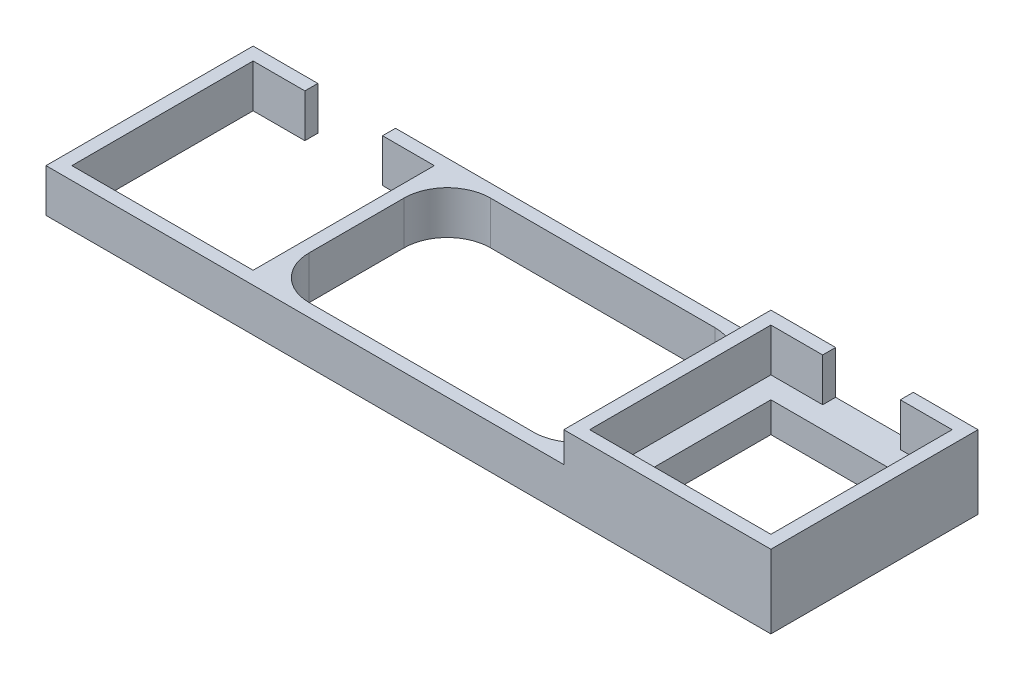
ISO-10303-21;
HEADER;
FILE_DESCRIPTION(('STEP AP214'),'2;1');
FILE_NAME('part.step','',(''),(''),'','','');
FILE_SCHEMA(('AUTOMOTIVE_DESIGN { 1 0 10303 214 1 1 1 1 }'));
ENDSEC;
DATA;
#1=APPLICATION_CONTEXT('core data for automotive mechanical design processes');
#2=APPLICATION_PROTOCOL_DEFINITION('international standard','automotive_design',2000,#1);
#3=PRODUCT_CONTEXT('',#1,'mechanical');
#4=PRODUCT('Part','Part','',(#3));
#5=PRODUCT_RELATED_PRODUCT_CATEGORY('part','',(#4));
#6=PRODUCT_DEFINITION_FORMATION('','',#4);
#7=PRODUCT_DEFINITION_CONTEXT('part definition',#1,'design');
#8=PRODUCT_DEFINITION('design','',#6,#7);
#9=PRODUCT_DEFINITION_SHAPE('','',#8);
#10=(LENGTH_UNIT() NAMED_UNIT(*) SI_UNIT(.MILLI.,.METRE.));
#11=(NAMED_UNIT(*) PLANE_ANGLE_UNIT() SI_UNIT($,.RADIAN.));
#12=(NAMED_UNIT(*) SI_UNIT($,.STERADIAN.) SOLID_ANGLE_UNIT());
#13=UNCERTAINTY_MEASURE_WITH_UNIT(LENGTH_MEASURE(1.E-05),#10,'distance_accuracy_value','');
#14=(GEOMETRIC_REPRESENTATION_CONTEXT(3) GLOBAL_UNCERTAINTY_ASSIGNED_CONTEXT((#13)) GLOBAL_UNIT_ASSIGNED_CONTEXT((#10,
#11,#12)) REPRESENTATION_CONTEXT('',''));
#15=CARTESIAN_POINT('',(0.,0.,0.));
#16=DIRECTION('',(0.,0.,1.));
#17=DIRECTION('',(1.,0.,0.));
#18=AXIS2_PLACEMENT_3D('',#15,#16,#17);
#19=CARTESIAN_POINT('',(-30.,10.,-35.));
#20=DIRECTION('',(-1.,0.,0.));
#21=DIRECTION('',(0.,-1.,0.));
#22=AXIS2_PLACEMENT_3D('',#19,#20,#21);
#23=PLANE('',#22);
#24=DIRECTION('',(0.,0.,1.));
#25=VECTOR('',#24,1.);
#26=CARTESIAN_POINT('',(-30.,7.,-64.313207915828));
#27=LINE('',#26,#25);
#28=CARTESIAN_POINT('',(-30.,7.,-45.));
#29=VERTEX_POINT('',#28);
#30=CARTESIAN_POINT('',(-30.,7.,-42.));
#31=VERTEX_POINT('',#30);
#32=EDGE_CURVE('E48',#29,#31,#27,.T.);
#33=ORIENTED_EDGE('',*,*,#32,.F.);
#34=DIRECTION('',(0.,1.,0.));
#35=VECTOR('',#34,1.);
#36=CARTESIAN_POINT('',(-30.,10.,-45.));
#37=LINE('',#36,#35);
#38=CARTESIAN_POINT('',(-30.,17.,-45.));
#39=VERTEX_POINT('',#38);
#40=EDGE_CURVE('E361',#29,#39,#37,.T.);
#41=ORIENTED_EDGE('',*,*,#40,.T.);
#42=DIRECTION('',(0.,0.,-1.));
#43=VECTOR('',#42,1.);
#44=CARTESIAN_POINT('',(-30.,17.,0.));
#45=LINE('',#44,#43);
#46=CARTESIAN_POINT('',(-30.,17.,-42.));
#47=VERTEX_POINT('',#46);
#48=EDGE_CURVE('E310',#47,#39,#45,.T.);
#49=ORIENTED_EDGE('',*,*,#48,.F.);
#50=DIRECTION('',(0.,-1.,0.));
#51=VECTOR('',#50,1.);
#52=CARTESIAN_POINT('',(-30.,10.,-42.));
#53=LINE('',#52,#51);
#54=EDGE_CURVE('E264',#47,#31,#53,.T.);
#55=ORIENTED_EDGE('',*,*,#54,.T.);
#56=EDGE_LOOP('',(#33,#41,#49,#55));
#57=FACE_BOUND('',#56,.T.);
#58=ADVANCED_FACE('F33',(#57),#23,.F.);
#59=CARTESIAN_POINT('',(-12.,10.,-35.));
#60=DIRECTION('',(1.,0.,0.));
#61=DIRECTION('',(0.,1.,0.));
#62=AXIS2_PLACEMENT_3D('',#59,#60,#61);
#63=PLANE('',#62);
#64=DIRECTION('',(0.,0.,1.));
#65=VECTOR('',#64,1.);
#66=CARTESIAN_POINT('',(-12.,7.,-64.313207915828));
#67=LINE('',#66,#65);
#68=CARTESIAN_POINT('',(-12.,7.,-45.));
#69=VERTEX_POINT('',#68);
#70=CARTESIAN_POINT('',(-12.,7.,-42.));
#71=VERTEX_POINT('',#70);
#72=EDGE_CURVE('E270',#69,#71,#67,.T.);
#73=ORIENTED_EDGE('',*,*,#72,.T.);
#74=DIRECTION('',(0.,1.,0.));
#75=VECTOR('',#74,1.);
#76=CARTESIAN_POINT('',(-12.,9.99999999999999,-42.));
#77=LINE('',#76,#75);
#78=CARTESIAN_POINT('',(-12.,17.,-42.));
#79=VERTEX_POINT('',#78);
#80=EDGE_CURVE('E255',#71,#79,#77,.T.);
#81=ORIENTED_EDGE('',*,*,#80,.T.);
#82=DIRECTION('',(0.,0.,1.));
#83=VECTOR('',#82,1.);
#84=CARTESIAN_POINT('',(-12.,17.,0.));
#85=LINE('',#84,#83);
#86=CARTESIAN_POINT('',(-12.,17.,-45.));
#87=VERTEX_POINT('',#86);
#88=EDGE_CURVE('E295',#87,#79,#85,.T.);
#89=ORIENTED_EDGE('',*,*,#88,.F.);
#90=DIRECTION('',(0.,-1.,0.));
#91=VECTOR('',#90,1.);
#92=CARTESIAN_POINT('',(-12.,10.,-45.));
#93=LINE('',#92,#91);
#94=EDGE_CURVE('E56',#87,#69,#93,.T.);
#95=ORIENTED_EDGE('',*,*,#94,.T.);
#96=EDGE_LOOP('',(#73,#81,#89,#95));
#97=FACE_BOUND('',#96,.T.);
#98=ADVANCED_FACE('F276',(#97),#63,.F.);
#99=CARTESIAN_POINT('',(0.,10.,0.));
#100=DIRECTION('',(0.,1.,0.));
#101=DIRECTION('',(0.,0.,1.));
#102=AXIS2_PLACEMENT_3D('',#99,#100,#101);
#103=PLANE('',#102);
#104=DIRECTION('',(1.,0.,0.));
#105=VECTOR('',#104,1.);
#106=CARTESIAN_POINT('',(-165.,10.,3.));
#107=LINE('',#106,#105);
#108=CARTESIAN_POINT('',(-165.,10.,3.));
#109=VERTEX_POINT('',#108);
#110=CARTESIAN_POINT('',(-45.,10.,3.));
#111=VERTEX_POINT('',#110);
#112=EDGE_CURVE('E448',#109,#111,#107,.T.);
#113=ORIENTED_EDGE('',*,*,#112,.T.);
#114=DIRECTION('',(0.,0.,-1.));
#115=VECTOR('',#114,1.);
#116=CARTESIAN_POINT('',(-45.,10.,0.));
#117=LINE('',#116,#115);
#118=CARTESIAN_POINT('',(-45.,10.,-10.));
#119=VERTEX_POINT('',#118);
#120=EDGE_CURVE('E282',#111,#119,#117,.T.);
#121=ORIENTED_EDGE('',*,*,#120,.T.);
#122=CARTESIAN_POINT('',(-55.,10.,-10.));
#123=DIRECTION('',(0.,1.,0.));
#124=DIRECTION('',(0.,0.,1.));
#125=AXIS2_PLACEMENT_3D('',#122,#123,#124);
#126=CIRCLE('',#125,10.);
#127=CARTESIAN_POINT('',(-55.,10.,0.));
#128=VERTEX_POINT('',#127);
#129=EDGE_CURVE('E511',#119,#128,#126,.F.);
#130=ORIENTED_EDGE('',*,*,#129,.T.);
#131=DIRECTION('',(1.,0.,0.));
#132=VECTOR('',#131,1.);
#133=CARTESIAN_POINT('',(-117.,10.,0.));
#134=LINE('',#133,#132);
#135=CARTESIAN_POINT('',(-107.,10.,0.));
#136=VERTEX_POINT('',#135);
#137=EDGE_CURVE('E382',#136,#128,#134,.T.);
#138=ORIENTED_EDGE('',*,*,#137,.F.);
#139=CARTESIAN_POINT('',(-107.,10.,-10.));
#140=DIRECTION('',(0.,1.,0.));
#141=DIRECTION('',(0.,0.,1.));
#142=AXIS2_PLACEMENT_3D('',#139,#140,#141);
#143=CIRCLE('',#142,10.);
#144=CARTESIAN_POINT('',(-117.,10.,-10.));
#145=VERTEX_POINT('',#144);
#146=EDGE_CURVE('E11',#136,#145,#143,.F.);
#147=ORIENTED_EDGE('',*,*,#146,.T.);
#148=DIRECTION('',(0.,0.,1.));
#149=VECTOR('',#148,1.);
#150=CARTESIAN_POINT('',(-117.,10.,-42.));
#151=LINE('',#150,#149);
#152=CARTESIAN_POINT('',(-117.,10.,-32.));
#153=VERTEX_POINT('',#152);
#154=EDGE_CURVE('E379',#153,#145,#151,.T.);
#155=ORIENTED_EDGE('',*,*,#154,.F.);
#156=CARTESIAN_POINT('',(-107.,10.,-32.));
#157=DIRECTION('',(0.,1.,0.));
#158=DIRECTION('',(0.,0.,1.));
#159=AXIS2_PLACEMENT_3D('',#156,#157,#158);
#160=CIRCLE('',#159,10.);
#161=CARTESIAN_POINT('',(-107.,10.,-42.));
#162=VERTEX_POINT('',#161);
#163=EDGE_CURVE('E507',#153,#162,#160,.F.);
#164=ORIENTED_EDGE('',*,*,#163,.T.);
#165=DIRECTION('',(-1.,0.,0.));
#166=VECTOR('',#165,1.);
#167=CARTESIAN_POINT('',(-117.,10.,-42.));
#168=LINE('',#167,#166);
#169=CARTESIAN_POINT('',(-55.,10.,-42.));
#170=VERTEX_POINT('',#169);
#171=EDGE_CURVE('E386',#170,#162,#168,.T.);
#172=ORIENTED_EDGE('',*,*,#171,.F.);
#173=CARTESIAN_POINT('',(-55.,10.,-32.));
#174=DIRECTION('',(0.,1.,0.));
#175=DIRECTION('',(0.,0.,1.));
#176=AXIS2_PLACEMENT_3D('',#173,#174,#175);
#177=CIRCLE('',#176,10.);
#178=CARTESIAN_POINT('',(-45.,10.,-32.));
#179=VERTEX_POINT('',#178);
#180=EDGE_CURVE('E502',#170,#179,#177,.F.);
#181=ORIENTED_EDGE('',*,*,#180,.T.);
#182=CARTESIAN_POINT('',(-45.,10.,-45.));
#183=VERTEX_POINT('',#182);
#184=EDGE_CURVE('E317',#179,#183,#117,.T.);
#185=ORIENTED_EDGE('',*,*,#184,.T.);
#186=DIRECTION('',(-1.,0.,0.));
#187=VECTOR('',#186,1.);
#188=CARTESIAN_POINT('',(-165.,10.,-45.));
#189=LINE('',#188,#187);
#190=CARTESIAN_POINT('',(-132.,10.,-45.));
#191=VERTEX_POINT('',#190);
#192=EDGE_CURVE('E453',#183,#191,#189,.T.);
#193=ORIENTED_EDGE('',*,*,#192,.T.);
#194=DIRECTION('',(0.,0.,-1.));
#195=VECTOR('',#194,1.);
#196=CARTESIAN_POINT('',(-132.,10.,-35.));
#197=LINE('',#196,#195);
#198=CARTESIAN_POINT('',(-132.,10.,-42.));
#199=VERTEX_POINT('',#198);
#200=EDGE_CURVE('E362',#199,#191,#197,.T.);
#201=ORIENTED_EDGE('',*,*,#200,.F.);
#202=DIRECTION('',(-1.,0.,0.));
#203=VECTOR('',#202,1.);
#204=CARTESIAN_POINT('',(-162.,10.,-42.));
#205=LINE('',#204,#203);
#206=CARTESIAN_POINT('',(-120.,10.,-42.));
#207=VERTEX_POINT('',#206);
#208=EDGE_CURVE('E420',#207,#199,#205,.T.);
#209=ORIENTED_EDGE('',*,*,#208,.F.);
#210=DIRECTION('',(0.,0.,-1.));
#211=VECTOR('',#210,1.);
#212=CARTESIAN_POINT('',(-120.,10.,-42.));
#213=LINE('',#212,#211);
#214=CARTESIAN_POINT('',(-120.,10.,0.));
#215=VERTEX_POINT('',#214);
#216=EDGE_CURVE('E416',#215,#207,#213,.T.);
#217=ORIENTED_EDGE('',*,*,#216,.F.);
#218=DIRECTION('',(1.,0.,0.));
#219=VECTOR('',#218,1.);
#220=CARTESIAN_POINT('',(-162.,10.,0.));
#221=LINE('',#220,#219);
#222=CARTESIAN_POINT('',(-162.,10.,0.));
#223=VERTEX_POINT('',#222);
#224=EDGE_CURVE('E413',#223,#215,#221,.T.);
#225=ORIENTED_EDGE('',*,*,#224,.F.);
#226=DIRECTION('',(0.,0.,1.));
#227=VECTOR('',#226,1.);
#228=CARTESIAN_POINT('',(-162.,10.,-42.));
#229=LINE('',#228,#227);
#230=CARTESIAN_POINT('',(-162.,10.,-42.));
#231=VERTEX_POINT('',#230);
#232=EDGE_CURVE('E411',#231,#223,#229,.T.);
#233=ORIENTED_EDGE('',*,*,#232,.F.);
#234=CARTESIAN_POINT('',(-150.,10.,-42.));
#235=VERTEX_POINT('',#234);
#236=EDGE_CURVE('E419',#235,#231,#205,.T.);
#237=ORIENTED_EDGE('',*,*,#236,.F.);
#238=DIRECTION('',(0.,0.,-1.));
#239=VECTOR('',#238,1.);
#240=CARTESIAN_POINT('',(-150.,10.,-35.));
#241=LINE('',#240,#239);
#242=CARTESIAN_POINT('',(-150.,10.,-45.));
#243=VERTEX_POINT('',#242);
#244=EDGE_CURVE('E372',#235,#243,#241,.T.);
#245=ORIENTED_EDGE('',*,*,#244,.T.);
#246=CARTESIAN_POINT('',(-165.,10.,-45.));
#247=VERTEX_POINT('',#246);
#248=EDGE_CURVE('E452',#243,#247,#189,.T.);
#249=ORIENTED_EDGE('',*,*,#248,.T.);
#250=DIRECTION('',(0.,0.,1.));
#251=VECTOR('',#250,1.);
#252=CARTESIAN_POINT('',(-165.,10.,-45.));
#253=LINE('',#252,#251);
#254=EDGE_CURVE('E445',#247,#109,#253,.T.);
#255=ORIENTED_EDGE('',*,*,#254,.T.);
#256=EDGE_LOOP('',(#113,#121,#130,#138,#147,#155,#164,#172,#181,#185,#193,#201,#209,#217,#225,
#233,#237,#245,#249,#255));
#257=FACE_BOUND('',#256,.T.);
#258=ADVANCED_FACE('F527',(#257),#103,.T.);
#259=CARTESIAN_POINT('',(-42.,10.,-42.));
#260=DIRECTION('',(0.,0.,1.));
#261=DIRECTION('',(1.,0.,0.));
#262=AXIS2_PLACEMENT_3D('',#259,#260,#261);
#263=PLANE('',#262);
#264=ORIENTED_EDGE('',*,*,#80,.F.);
#265=DIRECTION('',(1.,0.,0.));
#266=VECTOR('',#265,1.);
#267=CARTESIAN_POINT('',(-42.,7.,-42.));
#268=LINE('',#267,#266);
#269=CARTESIAN_POINT('',(0.,7.,-42.));
#270=VERTEX_POINT('',#269);
#271=EDGE_CURVE('E258',#71,#270,#268,.T.);
#272=ORIENTED_EDGE('',*,*,#271,.T.);
#273=DIRECTION('',(0.,-1.,0.));
#274=VECTOR('',#273,1.);
#275=CARTESIAN_POINT('',(0.,10.,-42.));
#276=LINE('',#275,#274);
#277=CARTESIAN_POINT('',(0.,17.,-42.));
#278=VERTEX_POINT('',#277);
#279=EDGE_CURVE('E402',#278,#270,#276,.T.);
#280=ORIENTED_EDGE('',*,*,#279,.F.);
#281=DIRECTION('',(1.,0.,0.));
#282=VECTOR('',#281,1.);
#283=CARTESIAN_POINT('',(0.,17.,-42.));
#284=LINE('',#283,#282);
#285=EDGE_CURVE('E261',#79,#278,#284,.T.);
#286=ORIENTED_EDGE('',*,*,#285,.F.);
#287=EDGE_LOOP('',(#264,#272,#280,#286));
#288=FACE_BOUND('',#287,.T.);
#289=ADVANCED_FACE('F257',(#288),#263,.T.);
#290=CARTESIAN_POINT('',(-42.,10.,-42.));
#291=DIRECTION('',(1.,0.,0.));
#292=DIRECTION('',(0.,0.,-1.));
#293=AXIS2_PLACEMENT_3D('',#290,#291,#292);
#294=PLANE('',#293);
#295=DIRECTION('',(0.,-1.,0.));
#296=VECTOR('',#295,1.);
#297=CARTESIAN_POINT('',(-42.,10.,0.));
#298=LINE('',#297,#296);
#299=CARTESIAN_POINT('',(-42.,17.,0.));
#300=VERTEX_POINT('',#299);
#301=CARTESIAN_POINT('',(-42.,7.,0.));
#302=VERTEX_POINT('',#301);
#303=EDGE_CURVE('E407',#300,#302,#298,.T.);
#304=ORIENTED_EDGE('',*,*,#303,.T.);
#305=DIRECTION('',(0.,0.,-1.));
#306=VECTOR('',#305,1.);
#307=CARTESIAN_POINT('',(-42.,7.,0.));
#308=LINE('',#307,#306);
#309=CARTESIAN_POINT('',(-42.,7.,-42.));
#310=VERTEX_POINT('',#309);
#311=EDGE_CURVE('E274',#302,#310,#308,.T.);
#312=ORIENTED_EDGE('',*,*,#311,.T.);
#313=DIRECTION('',(0.,-1.,0.));
#314=VECTOR('',#313,1.);
#315=CARTESIAN_POINT('',(-42.,10.,-42.));
#316=LINE('',#315,#314);
#317=CARTESIAN_POINT('',(-42.,17.,-42.));
#318=VERTEX_POINT('',#317);
#319=EDGE_CURVE('E389',#318,#310,#316,.T.);
#320=ORIENTED_EDGE('',*,*,#319,.F.);
#321=DIRECTION('',(0.,0.,-1.));
#322=VECTOR('',#321,1.);
#323=CARTESIAN_POINT('',(-42.,17.,0.));
#324=LINE('',#323,#322);
#325=EDGE_CURVE('E304',#300,#318,#324,.T.);
#326=ORIENTED_EDGE('',*,*,#325,.F.);
#327=EDGE_LOOP('',(#304,#312,#320,#326));
#328=FACE_BOUND('',#327,.T.);
#329=ADVANCED_FACE('F637',(#328),#294,.T.);
#330=CARTESIAN_POINT('',(-42.,10.,0.));
#331=DIRECTION('',(0.,0.,-1.));
#332=DIRECTION('',(-1.,0.,0.));
#333=AXIS2_PLACEMENT_3D('',#330,#331,#332);
#334=PLANE('',#333);
#335=DIRECTION('',(0.,-1.,0.));
#336=VECTOR('',#335,1.);
#337=CARTESIAN_POINT('',(0.,10.,0.));
#338=LINE('',#337,#336);
#339=CARTESIAN_POINT('',(0.,17.,0.));
#340=VERTEX_POINT('',#339);
#341=CARTESIAN_POINT('',(0.,7.,0.));
#342=VERTEX_POINT('',#341);
#343=EDGE_CURVE('E404',#340,#342,#338,.T.);
#344=ORIENTED_EDGE('',*,*,#343,.T.);
#345=DIRECTION('',(-1.,0.,0.));
#346=VECTOR('',#345,1.);
#347=CARTESIAN_POINT('',(-42.,7.,0.));
#348=LINE('',#347,#346);
#349=EDGE_CURVE('E356',#342,#302,#348,.T.);
#350=ORIENTED_EDGE('',*,*,#349,.T.);
#351=ORIENTED_EDGE('',*,*,#303,.F.);
#352=DIRECTION('',(-1.,0.,0.));
#353=VECTOR('',#352,1.);
#354=CARTESIAN_POINT('',(0.,17.,0.));
#355=LINE('',#354,#353);
#356=EDGE_CURVE('E301',#340,#300,#355,.T.);
#357=ORIENTED_EDGE('',*,*,#356,.F.);
#358=EDGE_LOOP('',(#344,#350,#351,#357));
#359=FACE_BOUND('',#358,.T.);
#360=ADVANCED_FACE('F642',(#359),#334,.T.);
#361=CARTESIAN_POINT('',(0.,10.,-42.));
#362=DIRECTION('',(-1.,0.,0.));
#363=DIRECTION('',(0.,0.,1.));
#364=AXIS2_PLACEMENT_3D('',#361,#362,#363);
#365=PLANE('',#364);
#366=ORIENTED_EDGE('',*,*,#279,.T.);
#367=DIRECTION('',(0.,0.,1.));
#368=VECTOR('',#367,1.);
#369=CARTESIAN_POINT('',(0.,7.,0.));
#370=LINE('',#369,#368);
#371=EDGE_CURVE('E272',#270,#342,#370,.T.);
#372=ORIENTED_EDGE('',*,*,#371,.T.);
#373=ORIENTED_EDGE('',*,*,#343,.F.);
#374=DIRECTION('',(0.,0.,1.));
#375=VECTOR('',#374,1.);
#376=CARTESIAN_POINT('',(0.,17.,0.));
#377=LINE('',#376,#375);
#378=EDGE_CURVE('E298',#278,#340,#377,.T.);
#379=ORIENTED_EDGE('',*,*,#378,.F.);
#380=EDGE_LOOP('',(#366,#372,#373,#379));
#381=FACE_BOUND('',#380,.T.);
#382=ADVANCED_FACE('F639',(#381),#365,.T.);
#383=ORIENTED_EDGE('',*,*,#319,.T.);
#384=EDGE_CURVE('E273',#310,#31,#268,.T.);
#385=ORIENTED_EDGE('',*,*,#384,.T.);
#386=ORIENTED_EDGE('',*,*,#54,.F.);
#387=DIRECTION('',(1.,0.,0.));
#388=VECTOR('',#387,1.);
#389=CARTESIAN_POINT('',(0.,17.,-42.));
#390=LINE('',#389,#388);
#391=EDGE_CURVE('E307',#318,#47,#390,.T.);
#392=ORIENTED_EDGE('',*,*,#391,.F.);
#393=EDGE_LOOP('',(#383,#385,#386,#392));
#394=FACE_BOUND('',#393,.T.);
#395=ADVANCED_FACE('F638',(#394),#263,.T.);
#396=CARTESIAN_POINT('',(-165.,10.,-45.));
#397=DIRECTION('',(0.,0.,1.));
#398=DIRECTION('',(1.,0.,0.));
#399=AXIS2_PLACEMENT_3D('',#396,#397,#398);
#400=PLANE('',#399);
#401=ORIENTED_EDGE('',*,*,#192,.F.);
#402=DIRECTION('',(0.,-1.,0.));
#403=VECTOR('',#402,1.);
#404=CARTESIAN_POINT('',(-45.,17.,-45.));
#405=LINE('',#404,#403);
#406=CARTESIAN_POINT('',(-45.,17.,-45.));
#407=VERTEX_POINT('',#406);
#408=EDGE_CURVE('E315',#407,#183,#405,.T.);
#409=ORIENTED_EDGE('',*,*,#408,.F.);
#410=DIRECTION('',(-1.,0.,0.));
#411=VECTOR('',#410,1.);
#412=CARTESIAN_POINT('',(0.,17.,-45.));
#413=LINE('',#412,#411);
#414=EDGE_CURVE('E313',#39,#407,#413,.T.);
#415=ORIENTED_EDGE('',*,*,#414,.F.);
#416=ORIENTED_EDGE('',*,*,#40,.F.);
#417=DIRECTION('',(-1.,0.,0.));
#418=VECTOR('',#417,1.);
#419=CARTESIAN_POINT('',(-12.,7.,-45.));
#420=LINE('',#419,#418);
#421=EDGE_CURVE('E278',#69,#29,#420,.T.);
#422=ORIENTED_EDGE('',*,*,#421,.F.);
#423=ORIENTED_EDGE('',*,*,#94,.F.);
#424=DIRECTION('',(-1.,0.,0.));
#425=VECTOR('',#424,1.);
#426=CARTESIAN_POINT('',(0.,17.,-45.));
#427=LINE('',#426,#425);
#428=CARTESIAN_POINT('',(3.,17.,-45.));
#429=VERTEX_POINT('',#428);
#430=EDGE_CURVE('E292',#429,#87,#427,.T.);
#431=ORIENTED_EDGE('',*,*,#430,.F.);
#432=DIRECTION('',(0.,-1.,0.));
#433=VECTOR('',#432,1.);
#434=CARTESIAN_POINT('',(3.,10.,-45.));
#435=LINE('',#434,#433);
#436=CARTESIAN_POINT('',(3.,0.,-45.));
#437=VERTEX_POINT('',#436);
#438=EDGE_CURVE('E466',#429,#437,#435,.T.);
#439=ORIENTED_EDGE('',*,*,#438,.T.);
#440=DIRECTION('',(-1.,0.,0.));
#441=VECTOR('',#440,1.);
#442=CARTESIAN_POINT('',(-165.,0.,-45.));
#443=LINE('',#442,#441);
#444=CARTESIAN_POINT('',(-132.,0.,-45.));
#445=VERTEX_POINT('',#444);
#446=EDGE_CURVE('E449',#437,#445,#443,.T.);
#447=ORIENTED_EDGE('',*,*,#446,.T.);
#448=DIRECTION('',(0.,-1.,0.));
#449=VECTOR('',#448,1.);
#450=CARTESIAN_POINT('',(-132.,10.,-45.));
#451=LINE('',#450,#449);
#452=EDGE_CURVE('E359',#191,#445,#451,.T.);
#453=ORIENTED_EDGE('',*,*,#452,.F.);
#454=EDGE_LOOP('',(#401,#409,#415,#416,#422,#423,#431,#439,#447,#453));
#455=FACE_BOUND('',#454,.T.);
#456=ADVANCED_FACE('F551',(#455),#400,.F.);
#457=CARTESIAN_POINT('',(-162.,10.,-42.));
#458=DIRECTION('',(0.,0.,1.));
#459=DIRECTION('',(1.,0.,0.));
#460=AXIS2_PLACEMENT_3D('',#457,#458,#459);
#461=PLANE('',#460);
#462=DIRECTION('',(0.,1.,0.));
#463=VECTOR('',#462,1.);
#464=CARTESIAN_POINT('',(-132.,10.,-42.));
#465=LINE('',#464,#463);
#466=CARTESIAN_POINT('',(-132.,0.,-42.));
#467=VERTEX_POINT('',#466);
#468=EDGE_CURVE('E477',#467,#199,#465,.T.);
#469=ORIENTED_EDGE('',*,*,#468,.F.);
#470=DIRECTION('',(-1.,0.,0.));
#471=VECTOR('',#470,1.);
#472=CARTESIAN_POINT('',(-162.,0.,-42.));
#473=LINE('',#472,#471);
#474=CARTESIAN_POINT('',(-120.,0.,-42.));
#475=VERTEX_POINT('',#474);
#476=EDGE_CURVE('E414',#475,#467,#473,.T.);
#477=ORIENTED_EDGE('',*,*,#476,.F.);
#478=DIRECTION('',(0.,-1.,0.));
#479=VECTOR('',#478,1.);
#480=CARTESIAN_POINT('',(-120.,10.,-42.));
#481=LINE('',#480,#479);
#482=EDGE_CURVE('E437',#207,#475,#481,.T.);
#483=ORIENTED_EDGE('',*,*,#482,.F.);
#484=ORIENTED_EDGE('',*,*,#208,.T.);
#485=EDGE_LOOP('',(#469,#477,#483,#484));
#486=FACE_BOUND('',#485,.T.);
#487=ADVANCED_FACE('F562',(#486),#461,.T.);
#488=CARTESIAN_POINT('',(0.,0.,0.));
#489=DIRECTION('',(0.,1.,0.));
#490=DIRECTION('',(0.,0.,1.));
#491=AXIS2_PLACEMENT_3D('',#488,#489,#490);
#492=PLANE('',#491);
#493=DIRECTION('',(0.,0.,-1.));
#494=VECTOR('',#493,1.);
#495=CARTESIAN_POINT('',(-132.,0.,-35.));
#496=LINE('',#495,#494);
#497=EDGE_CURVE('E369',#467,#445,#496,.T.);
#498=ORIENTED_EDGE('',*,*,#497,.T.);
#499=ORIENTED_EDGE('',*,*,#446,.F.);
#500=DIRECTION('',(0.,0.,-1.));
#501=VECTOR('',#500,1.);
#502=CARTESIAN_POINT('',(3.,0.,-45.));
#503=LINE('',#502,#501);
#504=CARTESIAN_POINT('',(3.,0.,3.));
#505=VERTEX_POINT('',#504);
#506=EDGE_CURVE('E460',#505,#437,#503,.T.);
#507=ORIENTED_EDGE('',*,*,#506,.F.);
#508=DIRECTION('',(1.,0.,0.));
#509=VECTOR('',#508,1.);
#510=CARTESIAN_POINT('',(-165.,0.,3.));
#511=LINE('',#510,#509);
#512=CARTESIAN_POINT('',(-165.,0.,3.));
#513=VERTEX_POINT('',#512);
#514=EDGE_CURVE('E458',#513,#505,#511,.T.);
#515=ORIENTED_EDGE('',*,*,#514,.F.);
#516=DIRECTION('',(0.,0.,1.));
#517=VECTOR('',#516,1.);
#518=CARTESIAN_POINT('',(-165.,0.,-45.));
#519=LINE('',#518,#517);
#520=CARTESIAN_POINT('',(-165.,0.,-45.));
#521=VERTEX_POINT('',#520);
#522=EDGE_CURVE('E444',#521,#513,#519,.T.);
#523=ORIENTED_EDGE('',*,*,#522,.F.);
#524=CARTESIAN_POINT('',(-150.,0.,-45.));
#525=VERTEX_POINT('',#524);
#526=EDGE_CURVE('E462',#525,#521,#443,.T.);
#527=ORIENTED_EDGE('',*,*,#526,.F.);
#528=DIRECTION('',(0.,0.,-1.));
#529=VECTOR('',#528,1.);
#530=CARTESIAN_POINT('',(-150.,0.,-35.));
#531=LINE('',#530,#529);
#532=CARTESIAN_POINT('',(-150.,0.,-42.));
#533=VERTEX_POINT('',#532);
#534=EDGE_CURVE('E375',#533,#525,#531,.T.);
#535=ORIENTED_EDGE('',*,*,#534,.F.);
#536=CARTESIAN_POINT('',(-162.,0.,-42.));
#537=VERTEX_POINT('',#536);
#538=EDGE_CURVE('E432',#533,#537,#473,.T.);
#539=ORIENTED_EDGE('',*,*,#538,.T.);
#540=DIRECTION('',(0.,0.,1.));
#541=VECTOR('',#540,1.);
#542=CARTESIAN_POINT('',(-162.,0.,-42.));
#543=LINE('',#542,#541);
#544=CARTESIAN_POINT('',(-162.,0.,0.));
#545=VERTEX_POINT('',#544);
#546=EDGE_CURVE('E410',#537,#545,#543,.T.);
#547=ORIENTED_EDGE('',*,*,#546,.T.);
#548=DIRECTION('',(1.,0.,0.));
#549=VECTOR('',#548,1.);
#550=CARTESIAN_POINT('',(-162.,0.,0.));
#551=LINE('',#550,#549);
#552=CARTESIAN_POINT('',(-120.,0.,0.));
#553=VERTEX_POINT('',#552);
#554=EDGE_CURVE('E426',#545,#553,#551,.T.);
#555=ORIENTED_EDGE('',*,*,#554,.T.);
#556=DIRECTION('',(0.,0.,-1.));
#557=VECTOR('',#556,1.);
#558=CARTESIAN_POINT('',(-120.,0.,-42.));
#559=LINE('',#558,#557);
#560=EDGE_CURVE('E429',#553,#475,#559,.T.);
#561=ORIENTED_EDGE('',*,*,#560,.T.);
#562=ORIENTED_EDGE('',*,*,#476,.T.);
#563=EDGE_LOOP('',(#498,#499,#507,#515,#523,#527,#535,#539,#547,#555,#561,#562));
#564=FACE_BOUND('',#563,.T.);
#565=DIRECTION('',(-1.,0.,0.));
#566=VECTOR('',#565,1.);
#567=CARTESIAN_POINT('',(-117.,0.,-42.));
#568=LINE('',#567,#566);
#569=CARTESIAN_POINT('',(-55.,0.,-42.));
#570=VERTEX_POINT('',#569);
#571=CARTESIAN_POINT('',(-107.,0.,-42.));
#572=VERTEX_POINT('',#571);
#573=EDGE_CURVE('E383',#570,#572,#568,.T.);
#574=ORIENTED_EDGE('',*,*,#573,.T.);
#575=CARTESIAN_POINT('',(-107.,0.,-32.));
#576=DIRECTION('',(0.,1.,0.));
#577=DIRECTION('',(0.,0.,1.));
#578=AXIS2_PLACEMENT_3D('',#575,#576,#577);
#579=CIRCLE('',#578,10.);
#580=CARTESIAN_POINT('',(-117.,0.,-32.));
#581=VERTEX_POINT('',#580);
#582=EDGE_CURVE('E505',#572,#581,#579,.T.);
#583=ORIENTED_EDGE('',*,*,#582,.T.);
#584=DIRECTION('',(0.,0.,1.));
#585=VECTOR('',#584,1.);
#586=CARTESIAN_POINT('',(-117.,0.,-42.));
#587=LINE('',#586,#585);
#588=CARTESIAN_POINT('',(-117.,0.,-10.));
#589=VERTEX_POINT('',#588);
#590=EDGE_CURVE('E364',#581,#589,#587,.T.);
#591=ORIENTED_EDGE('',*,*,#590,.T.);
#592=CARTESIAN_POINT('',(-107.,0.,-10.));
#593=DIRECTION('',(0.,1.,0.));
#594=DIRECTION('',(0.,0.,1.));
#595=AXIS2_PLACEMENT_3D('',#592,#593,#594);
#596=CIRCLE('',#595,10.);
#597=CARTESIAN_POINT('',(-107.,0.,0.));
#598=VERTEX_POINT('',#597);
#599=EDGE_CURVE('E41',#589,#598,#596,.T.);
#600=ORIENTED_EDGE('',*,*,#599,.T.);
#601=DIRECTION('',(1.,0.,0.));
#602=VECTOR('',#601,1.);
#603=CARTESIAN_POINT('',(-117.,0.,0.));
#604=LINE('',#603,#602);
#605=CARTESIAN_POINT('',(-55.,0.,0.));
#606=VERTEX_POINT('',#605);
#607=EDGE_CURVE('E392',#598,#606,#604,.T.);
#608=ORIENTED_EDGE('',*,*,#607,.T.);
#609=CARTESIAN_POINT('',(-55.,0.,-10.));
#610=DIRECTION('',(0.,1.,0.));
#611=DIRECTION('',(0.,0.,1.));
#612=AXIS2_PLACEMENT_3D('',#609,#610,#611);
#613=CIRCLE('',#612,10.);
#614=CARTESIAN_POINT('',(-45.,0.,-10.));
#615=VERTEX_POINT('',#614);
#616=EDGE_CURVE('E509',#606,#615,#613,.T.);
#617=ORIENTED_EDGE('',*,*,#616,.T.);
#618=DIRECTION('',(0.,0.,-1.));
#619=VECTOR('',#618,1.);
#620=CARTESIAN_POINT('',(-45.,0.,-42.));
#621=LINE('',#620,#619);
#622=CARTESIAN_POINT('',(-45.,0.,-32.));
#623=VERTEX_POINT('',#622);
#624=EDGE_CURVE('E395',#615,#623,#621,.T.);
#625=ORIENTED_EDGE('',*,*,#624,.T.);
#626=CARTESIAN_POINT('',(-55.,0.,-32.));
#627=DIRECTION('',(0.,1.,0.));
#628=DIRECTION('',(0.,0.,1.));
#629=AXIS2_PLACEMENT_3D('',#626,#627,#628);
#630=CIRCLE('',#629,10.);
#631=EDGE_CURVE('E500',#623,#570,#630,.T.);
#632=ORIENTED_EDGE('',*,*,#631,.T.);
#633=EDGE_LOOP('',(#574,#583,#591,#600,#608,#617,#625,#632));
#634=FACE_BOUND('',#633,.T.);
#635=DIRECTION('',(0.,0.,-1.));
#636=VECTOR('',#635,1.);
#637=CARTESIAN_POINT('',(-37.,0.,-5.));
#638=LINE('',#637,#636);
#639=CARTESIAN_POINT('',(-37.,0.,-5.));
#640=VERTEX_POINT('',#639);
#641=CARTESIAN_POINT('',(-37.,0.,-37.));
#642=VERTEX_POINT('',#641);
#643=EDGE_CURVE('E321',#640,#642,#638,.T.);
#644=ORIENTED_EDGE('',*,*,#643,.F.);
#645=DIRECTION('',(-1.,0.,0.));
#646=VECTOR('',#645,1.);
#647=CARTESIAN_POINT('',(-37.,0.,-5.));
#648=LINE('',#647,#646);
#649=CARTESIAN_POINT('',(-5.,0.,-5.));
#650=VERTEX_POINT('',#649);
#651=EDGE_CURVE('E326',#650,#640,#648,.T.);
#652=ORIENTED_EDGE('',*,*,#651,.F.);
#653=DIRECTION('',(0.,0.,1.));
#654=VECTOR('',#653,1.);
#655=CARTESIAN_POINT('',(-5.,0.,-5.));
#656=LINE('',#655,#654);
#657=CARTESIAN_POINT('',(-4.99999999999999,0.,-37.));
#658=VERTEX_POINT('',#657);
#659=EDGE_CURVE('E340',#658,#650,#656,.T.);
#660=ORIENTED_EDGE('',*,*,#659,.F.);
#661=DIRECTION('',(1.,0.,0.));
#662=VECTOR('',#661,1.);
#663=CARTESIAN_POINT('',(-37.,0.,-37.));
#664=LINE('',#663,#662);
#665=EDGE_CURVE('E337',#642,#658,#664,.T.);
#666=ORIENTED_EDGE('',*,*,#665,.F.);
#667=EDGE_LOOP('',(#644,#652,#660,#666));
#668=FACE_BOUND('',#667,.T.);
#669=ADVANCED_FACE('F514',(#564,#634,#668),#492,.F.);
#670=CARTESIAN_POINT('',(-165.,10.,-45.));
#671=DIRECTION('',(1.,0.,0.));
#672=DIRECTION('',(0.,0.,-1.));
#673=AXIS2_PLACEMENT_3D('',#670,#671,#672);
#674=PLANE('',#673);
#675=ORIENTED_EDGE('',*,*,#522,.T.);
#676=DIRECTION('',(0.,-1.,0.));
#677=VECTOR('',#676,1.);
#678=CARTESIAN_POINT('',(-165.,10.,3.));
#679=LINE('',#678,#677);
#680=EDGE_CURVE('E472',#109,#513,#679,.T.);
#681=ORIENTED_EDGE('',*,*,#680,.F.);
#682=ORIENTED_EDGE('',*,*,#254,.F.);
#683=DIRECTION('',(0.,-1.,0.));
#684=VECTOR('',#683,1.);
#685=CARTESIAN_POINT('',(-165.,10.,-45.));
#686=LINE('',#685,#684);
#687=EDGE_CURVE('E455',#247,#521,#686,.T.);
#688=ORIENTED_EDGE('',*,*,#687,.T.);
#689=EDGE_LOOP('',(#675,#681,#682,#688));
#690=FACE_BOUND('',#689,.T.);
#691=ADVANCED_FACE('F594',(#690),#674,.F.);
#692=CARTESIAN_POINT('',(-165.,10.,3.));
#693=DIRECTION('',(0.,0.,-1.));
#694=DIRECTION('',(-1.,0.,0.));
#695=AXIS2_PLACEMENT_3D('',#692,#693,#694);
#696=PLANE('',#695);
#697=ORIENTED_EDGE('',*,*,#514,.T.);
#698=DIRECTION('',(0.,-1.,0.));
#699=VECTOR('',#698,1.);
#700=CARTESIAN_POINT('',(3.,10.,3.));
#701=LINE('',#700,#699);
#702=CARTESIAN_POINT('',(3.,17.,2.99999999999999));
#703=VERTEX_POINT('',#702);
#704=EDGE_CURVE('E469',#703,#505,#701,.T.);
#705=ORIENTED_EDGE('',*,*,#704,.F.);
#706=DIRECTION('',(1.,0.,0.));
#707=VECTOR('',#706,1.);
#708=CARTESIAN_POINT('',(0.,17.,3.));
#709=LINE('',#708,#707);
#710=CARTESIAN_POINT('',(-45.,17.,3.));
#711=VERTEX_POINT('',#710);
#712=EDGE_CURVE('E286',#711,#703,#709,.T.);
#713=ORIENTED_EDGE('',*,*,#712,.F.);
#714=DIRECTION('',(0.,-1.,0.));
#715=VECTOR('',#714,1.);
#716=CARTESIAN_POINT('',(-45.,17.,3.));
#717=LINE('',#716,#715);
#718=EDGE_CURVE('E319',#711,#111,#717,.T.);
#719=ORIENTED_EDGE('',*,*,#718,.T.);
#720=ORIENTED_EDGE('',*,*,#112,.F.);
#721=ORIENTED_EDGE('',*,*,#680,.T.);
#722=EDGE_LOOP('',(#697,#705,#713,#719,#720,#721));
#723=FACE_BOUND('',#722,.T.);
#724=ADVANCED_FACE('F597',(#723),#696,.F.);
#725=CARTESIAN_POINT('',(3.,10.,-45.));
#726=DIRECTION('',(-1.,0.,0.));
#727=DIRECTION('',(0.,0.,1.));
#728=AXIS2_PLACEMENT_3D('',#725,#726,#727);
#729=PLANE('',#728);
#730=ORIENTED_EDGE('',*,*,#506,.T.);
#731=ORIENTED_EDGE('',*,*,#438,.F.);
#732=DIRECTION('',(0.,0.,-1.));
#733=VECTOR('',#732,1.);
#734=CARTESIAN_POINT('',(3.,17.,0.));
#735=LINE('',#734,#733);
#736=EDGE_CURVE('E289',#703,#429,#735,.T.);
#737=ORIENTED_EDGE('',*,*,#736,.F.);
#738=ORIENTED_EDGE('',*,*,#704,.T.);
#739=EDGE_LOOP('',(#730,#731,#737,#738));
#740=FACE_BOUND('',#739,.T.);
#741=ADVANCED_FACE('F664',(#740),#729,.F.);
#742=ORIENTED_EDGE('',*,*,#248,.F.);
#743=DIRECTION('',(0.,1.,0.));
#744=VECTOR('',#743,1.);
#745=CARTESIAN_POINT('',(-150.,10.,-45.));
#746=LINE('',#745,#744);
#747=EDGE_CURVE('E367',#525,#243,#746,.T.);
#748=ORIENTED_EDGE('',*,*,#747,.F.);
#749=ORIENTED_EDGE('',*,*,#526,.T.);
#750=ORIENTED_EDGE('',*,*,#687,.F.);
#751=EDGE_LOOP('',(#742,#748,#749,#750));
#752=FACE_BOUND('',#751,.T.);
#753=ADVANCED_FACE('F589',(#752),#400,.F.);
#754=CARTESIAN_POINT('',(-162.,10.,-42.));
#755=DIRECTION('',(1.,0.,0.));
#756=DIRECTION('',(0.,0.,-1.));
#757=AXIS2_PLACEMENT_3D('',#754,#755,#756);
#758=PLANE('',#757);
#759=ORIENTED_EDGE('',*,*,#546,.F.);
#760=DIRECTION('',(0.,-1.,0.));
#761=VECTOR('',#760,1.);
#762=CARTESIAN_POINT('',(-162.,10.,-42.));
#763=LINE('',#762,#761);
#764=EDGE_CURVE('E423',#231,#537,#763,.T.);
#765=ORIENTED_EDGE('',*,*,#764,.F.);
#766=ORIENTED_EDGE('',*,*,#232,.T.);
#767=DIRECTION('',(0.,-1.,0.));
#768=VECTOR('',#767,1.);
#769=CARTESIAN_POINT('',(-162.,10.,0.));
#770=LINE('',#769,#768);
#771=EDGE_CURVE('E441',#223,#545,#770,.T.);
#772=ORIENTED_EDGE('',*,*,#771,.T.);
#773=EDGE_LOOP('',(#759,#765,#766,#772));
#774=FACE_BOUND('',#773,.T.);
#775=ADVANCED_FACE('F575',(#774),#758,.T.);
#776=CARTESIAN_POINT('',(-162.,10.,0.));
#777=DIRECTION('',(0.,0.,-1.));
#778=DIRECTION('',(-1.,0.,0.));
#779=AXIS2_PLACEMENT_3D('',#776,#777,#778);
#780=PLANE('',#779);
#781=ORIENTED_EDGE('',*,*,#554,.F.);
#782=ORIENTED_EDGE('',*,*,#771,.F.);
#783=ORIENTED_EDGE('',*,*,#224,.T.);
#784=DIRECTION('',(0.,-1.,0.));
#785=VECTOR('',#784,1.);
#786=CARTESIAN_POINT('',(-120.,10.,0.));
#787=LINE('',#786,#785);
#788=EDGE_CURVE('E439',#215,#553,#787,.T.);
#789=ORIENTED_EDGE('',*,*,#788,.T.);
#790=EDGE_LOOP('',(#781,#782,#783,#789));
#791=FACE_BOUND('',#790,.T.);
#792=ADVANCED_FACE('F571',(#791),#780,.T.);
#793=CARTESIAN_POINT('',(-120.,10.,-42.));
#794=DIRECTION('',(-1.,0.,0.));
#795=DIRECTION('',(0.,0.,1.));
#796=AXIS2_PLACEMENT_3D('',#793,#794,#795);
#797=PLANE('',#796);
#798=ORIENTED_EDGE('',*,*,#560,.F.);
#799=ORIENTED_EDGE('',*,*,#788,.F.);
#800=ORIENTED_EDGE('',*,*,#216,.T.);
#801=ORIENTED_EDGE('',*,*,#482,.T.);
#802=EDGE_LOOP('',(#798,#799,#800,#801));
#803=FACE_BOUND('',#802,.T.);
#804=ADVANCED_FACE('F569',(#803),#797,.T.);
#805=DIRECTION('',(0.,-1.,0.));
#806=VECTOR('',#805,1.);
#807=CARTESIAN_POINT('',(-150.,10.,-42.));
#808=LINE('',#807,#806);
#809=EDGE_CURVE('E263',#235,#533,#808,.T.);
#810=ORIENTED_EDGE('',*,*,#809,.F.);
#811=ORIENTED_EDGE('',*,*,#236,.T.);
#812=ORIENTED_EDGE('',*,*,#764,.T.);
#813=ORIENTED_EDGE('',*,*,#538,.F.);
#814=EDGE_LOOP('',(#810,#811,#812,#813));
#815=FACE_BOUND('',#814,.T.);
#816=ADVANCED_FACE('F582',(#815),#461,.T.);
#817=CARTESIAN_POINT('',(-117.,10.,-42.));
#818=DIRECTION('',(1.,0.,0.));
#819=DIRECTION('',(0.,0.,-1.));
#820=AXIS2_PLACEMENT_3D('',#817,#818,#819);
#821=PLANE('',#820);
#822=ORIENTED_EDGE('',*,*,#590,.F.);
#823=DIRECTION('',(0.,-1.,0.));
#824=VECTOR('',#823,1.);
#825=CARTESIAN_POINT('',(-117.,10.,-32.));
#826=LINE('',#825,#824);
#827=EDGE_CURVE('E493',#581,#153,#826,.F.);
#828=ORIENTED_EDGE('',*,*,#827,.T.);
#829=ORIENTED_EDGE('',*,*,#154,.T.);
#830=DIRECTION('',(0.,-1.,0.));
#831=VECTOR('',#830,1.);
#832=CARTESIAN_POINT('',(-117.,0.,-10.));
#833=LINE('',#832,#831);
#834=EDGE_CURVE('E490',#145,#589,#833,.T.);
#835=ORIENTED_EDGE('',*,*,#834,.T.);
#836=EDGE_LOOP('',(#822,#828,#829,#835));
#837=FACE_BOUND('',#836,.T.);
#838=ADVANCED_FACE('F530',(#837),#821,.T.);
#839=CARTESIAN_POINT('',(-117.,10.,0.));
#840=DIRECTION('',(0.,0.,-1.));
#841=DIRECTION('',(-1.,0.,0.));
#842=AXIS2_PLACEMENT_3D('',#839,#840,#841);
#843=PLANE('',#842);
#844=ORIENTED_EDGE('',*,*,#137,.T.);
#845=DIRECTION('',(0.,-1.,0.));
#846=VECTOR('',#845,1.);
#847=CARTESIAN_POINT('',(-55.,0.,0.));
#848=LINE('',#847,#846);
#849=EDGE_CURVE('E497',#128,#606,#848,.T.);
#850=ORIENTED_EDGE('',*,*,#849,.T.);
#851=ORIENTED_EDGE('',*,*,#607,.F.);
#852=DIRECTION('',(0.,-1.,0.));
#853=VECTOR('',#852,1.);
#854=CARTESIAN_POINT('',(-107.,10.,0.));
#855=LINE('',#854,#853);
#856=EDGE_CURVE('E495',#598,#136,#855,.F.);
#857=ORIENTED_EDGE('',*,*,#856,.T.);
#858=EDGE_LOOP('',(#844,#850,#851,#857));
#859=FACE_BOUND('',#858,.T.);
#860=ADVANCED_FACE('F521',(#859),#843,.T.);
#861=CARTESIAN_POINT('',(-45.,10.,-42.));
#862=DIRECTION('',(-1.,0.,0.));
#863=DIRECTION('',(0.,0.,1.));
#864=AXIS2_PLACEMENT_3D('',#861,#862,#863);
#865=PLANE('',#864);
#866=ORIENTED_EDGE('',*,*,#184,.F.);
#867=DIRECTION('',(0.,-1.,0.));
#868=VECTOR('',#867,1.);
#869=CARTESIAN_POINT('',(-45.,0.,-32.));
#870=LINE('',#869,#868);
#871=EDGE_CURVE('E482',#179,#623,#870,.T.);
#872=ORIENTED_EDGE('',*,*,#871,.T.);
#873=ORIENTED_EDGE('',*,*,#624,.F.);
#874=DIRECTION('',(0.,-1.,0.));
#875=VECTOR('',#874,1.);
#876=CARTESIAN_POINT('',(-45.,10.,-10.));
#877=LINE('',#876,#875);
#878=EDGE_CURVE('E479',#615,#119,#877,.F.);
#879=ORIENTED_EDGE('',*,*,#878,.T.);
#880=ORIENTED_EDGE('',*,*,#120,.F.);
#881=ORIENTED_EDGE('',*,*,#718,.F.);
#882=DIRECTION('',(0.,0.,-1.));
#883=VECTOR('',#882,1.);
#884=CARTESIAN_POINT('',(-45.,17.,0.));
#885=LINE('',#884,#883);
#886=EDGE_CURVE('E283',#711,#407,#885,.T.);
#887=ORIENTED_EDGE('',*,*,#886,.T.);
#888=ORIENTED_EDGE('',*,*,#408,.T.);
#889=EDGE_LOOP('',(#866,#872,#873,#879,#880,#881,#887,#888));
#890=FACE_BOUND('',#889,.T.);
#891=ADVANCED_FACE('F600',(#890),#865,.T.);
#892=CARTESIAN_POINT('',(-117.,10.,-42.));
#893=DIRECTION('',(0.,0.,1.));
#894=DIRECTION('',(1.,0.,0.));
#895=AXIS2_PLACEMENT_3D('',#892,#893,#894);
#896=PLANE('',#895);
#897=ORIENTED_EDGE('',*,*,#573,.F.);
#898=DIRECTION('',(0.,-1.,0.));
#899=VECTOR('',#898,1.);
#900=CARTESIAN_POINT('',(-55.,10.,-42.));
#901=LINE('',#900,#899);
#902=EDGE_CURVE('E488',#570,#170,#901,.F.);
#903=ORIENTED_EDGE('',*,*,#902,.T.);
#904=ORIENTED_EDGE('',*,*,#171,.T.);
#905=DIRECTION('',(0.,-1.,0.));
#906=VECTOR('',#905,1.);
#907=CARTESIAN_POINT('',(-107.,0.,-42.));
#908=LINE('',#907,#906);
#909=EDGE_CURVE('E485',#162,#572,#908,.T.);
#910=ORIENTED_EDGE('',*,*,#909,.T.);
#911=EDGE_LOOP('',(#897,#903,#904,#910));
#912=FACE_BOUND('',#911,.T.);
#913=ADVANCED_FACE('F539',(#912),#896,.T.);
#914=CARTESIAN_POINT('',(-150.,10.,-35.));
#915=DIRECTION('',(-1.,0.,0.));
#916=DIRECTION('',(0.,0.,1.));
#917=AXIS2_PLACEMENT_3D('',#914,#915,#916);
#918=PLANE('',#917);
#919=ORIENTED_EDGE('',*,*,#809,.T.);
#920=ORIENTED_EDGE('',*,*,#534,.T.);
#921=ORIENTED_EDGE('',*,*,#747,.T.);
#922=ORIENTED_EDGE('',*,*,#244,.F.);
#923=EDGE_LOOP('',(#919,#920,#921,#922));
#924=FACE_BOUND('',#923,.T.);
#925=ADVANCED_FACE('F622',(#924),#918,.F.);
#926=CARTESIAN_POINT('',(-132.,10.,-35.));
#927=DIRECTION('',(1.,0.,0.));
#928=DIRECTION('',(0.,0.,-1.));
#929=AXIS2_PLACEMENT_3D('',#926,#927,#928);
#930=PLANE('',#929);
#931=ORIENTED_EDGE('',*,*,#468,.T.);
#932=ORIENTED_EDGE('',*,*,#200,.T.);
#933=ORIENTED_EDGE('',*,*,#452,.T.);
#934=ORIENTED_EDGE('',*,*,#497,.F.);
#935=EDGE_LOOP('',(#931,#932,#933,#934));
#936=FACE_BOUND('',#935,.T.);
#937=ADVANCED_FACE('F555',(#936),#930,.F.);
#938=CARTESIAN_POINT('',(0.,7.,0.));
#939=DIRECTION('',(0.,-1.,0.));
#940=DIRECTION('',(0.,0.,-1.));
#941=AXIS2_PLACEMENT_3D('',#938,#939,#940);
#942=PLANE('',#941);
#943=DIRECTION('',(-1.,0.,0.));
#944=VECTOR('',#943,1.);
#945=CARTESIAN_POINT('',(-37.,7.,-5.));
#946=LINE('',#945,#944);
#947=CARTESIAN_POINT('',(-5.,7.,-5.));
#948=VERTEX_POINT('',#947);
#949=CARTESIAN_POINT('',(-37.,7.,-5.));
#950=VERTEX_POINT('',#949);
#951=EDGE_CURVE('E332',#948,#950,#946,.T.);
#952=ORIENTED_EDGE('',*,*,#951,.T.);
#953=DIRECTION('',(0.,0.,-1.));
#954=VECTOR('',#953,1.);
#955=CARTESIAN_POINT('',(-37.,7.,-5.));
#956=LINE('',#955,#954);
#957=CARTESIAN_POINT('',(-37.,7.,-37.));
#958=VERTEX_POINT('',#957);
#959=EDGE_CURVE('E322',#950,#958,#956,.T.);
#960=ORIENTED_EDGE('',*,*,#959,.T.);
#961=DIRECTION('',(1.,0.,0.));
#962=VECTOR('',#961,1.);
#963=CARTESIAN_POINT('',(-37.,7.,-37.));
#964=LINE('',#963,#962);
#965=CARTESIAN_POINT('',(-4.99999999999999,7.,-37.));
#966=VERTEX_POINT('',#965);
#967=EDGE_CURVE('E325',#958,#966,#964,.T.);
#968=ORIENTED_EDGE('',*,*,#967,.T.);
#969=DIRECTION('',(0.,0.,1.));
#970=VECTOR('',#969,1.);
#971=CARTESIAN_POINT('',(-5.,7.,-5.));
#972=LINE('',#971,#970);
#973=EDGE_CURVE('E329',#966,#948,#972,.T.);
#974=ORIENTED_EDGE('',*,*,#973,.T.);
#975=EDGE_LOOP('',(#952,#960,#968,#974));
#976=FACE_BOUND('',#975,.T.);
#977=ORIENTED_EDGE('',*,*,#311,.F.);
#978=ORIENTED_EDGE('',*,*,#349,.F.);
#979=ORIENTED_EDGE('',*,*,#371,.F.);
#980=ORIENTED_EDGE('',*,*,#271,.F.);
#981=ORIENTED_EDGE('',*,*,#72,.F.);
#982=ORIENTED_EDGE('',*,*,#421,.T.);
#983=ORIENTED_EDGE('',*,*,#32,.T.);
#984=ORIENTED_EDGE('',*,*,#384,.F.);
#985=EDGE_LOOP('',(#977,#978,#979,#980,#981,#982,#983,#984));
#986=FACE_BOUND('',#985,.T.);
#987=ADVANCED_FACE('F268',(#976,#986),#942,.F.);
#988=CARTESIAN_POINT('',(-37.,7.,-5.));
#989=DIRECTION('',(-1.,0.,0.));
#990=DIRECTION('',(0.,0.,1.));
#991=AXIS2_PLACEMENT_3D('',#988,#989,#990);
#992=PLANE('',#991);
#993=ORIENTED_EDGE('',*,*,#643,.T.);
#994=DIRECTION('',(0.,-1.,0.));
#995=VECTOR('',#994,1.);
#996=CARTESIAN_POINT('',(-37.,7.,-37.));
#997=LINE('',#996,#995);
#998=EDGE_CURVE('E335',#958,#642,#997,.T.);
#999=ORIENTED_EDGE('',*,*,#998,.F.);
#1000=ORIENTED_EDGE('',*,*,#959,.F.);
#1001=DIRECTION('',(0.,-1.,0.));
#1002=VECTOR('',#1001,1.);
#1003=CARTESIAN_POINT('',(-37.,7.,-5.));
#1004=LINE('',#1003,#1002);
#1005=EDGE_CURVE('E345',#950,#640,#1004,.T.);
#1006=ORIENTED_EDGE('',*,*,#1005,.T.);
#1007=EDGE_LOOP('',(#993,#999,#1000,#1006));
#1008=FACE_BOUND('',#1007,.T.);
#1009=ADVANCED_FACE('F690',(#1008),#992,.F.);
#1010=CARTESIAN_POINT('',(-37.,7.,-5.));
#1011=DIRECTION('',(0.,0.,1.));
#1012=DIRECTION('',(1.,0.,0.));
#1013=AXIS2_PLACEMENT_3D('',#1010,#1011,#1012);
#1014=PLANE('',#1013);
#1015=ORIENTED_EDGE('',*,*,#651,.T.);
#1016=ORIENTED_EDGE('',*,*,#1005,.F.);
#1017=ORIENTED_EDGE('',*,*,#951,.F.);
#1018=DIRECTION('',(0.,-1.,0.));
#1019=VECTOR('',#1018,1.);
#1020=CARTESIAN_POINT('',(-5.,7.,-5.));
#1021=LINE('',#1020,#1019);
#1022=EDGE_CURVE('E347',#948,#650,#1021,.T.);
#1023=ORIENTED_EDGE('',*,*,#1022,.T.);
#1024=EDGE_LOOP('',(#1015,#1016,#1017,#1023));
#1025=FACE_BOUND('',#1024,.T.);
#1026=ADVANCED_FACE('F687',(#1025),#1014,.F.);
#1027=CARTESIAN_POINT('',(-5.,7.,-5.));
#1028=DIRECTION('',(1.,0.,0.));
#1029=DIRECTION('',(0.,0.,-1.));
#1030=AXIS2_PLACEMENT_3D('',#1027,#1028,#1029);
#1031=PLANE('',#1030);
#1032=ORIENTED_EDGE('',*,*,#659,.T.);
#1033=ORIENTED_EDGE('',*,*,#1022,.F.);
#1034=ORIENTED_EDGE('',*,*,#973,.F.);
#1035=DIRECTION('',(0.,-1.,0.));
#1036=VECTOR('',#1035,1.);
#1037=CARTESIAN_POINT('',(-4.99999999999999,7.,-37.));
#1038=LINE('',#1037,#1036);
#1039=EDGE_CURVE('E349',#966,#658,#1038,.T.);
#1040=ORIENTED_EDGE('',*,*,#1039,.T.);
#1041=EDGE_LOOP('',(#1032,#1033,#1034,#1040));
#1042=FACE_BOUND('',#1041,.T.);
#1043=ADVANCED_FACE('F683',(#1042),#1031,.F.);
#1044=CARTESIAN_POINT('',(-37.,7.,-37.));
#1045=DIRECTION('',(0.,0.,-1.));
#1046=DIRECTION('',(-1.,0.,0.));
#1047=AXIS2_PLACEMENT_3D('',#1044,#1045,#1046);
#1048=PLANE('',#1047);
#1049=ORIENTED_EDGE('',*,*,#665,.T.);
#1050=ORIENTED_EDGE('',*,*,#1039,.F.);
#1051=ORIENTED_EDGE('',*,*,#967,.F.);
#1052=ORIENTED_EDGE('',*,*,#998,.T.);
#1053=EDGE_LOOP('',(#1049,#1050,#1051,#1052));
#1054=FACE_BOUND('',#1053,.T.);
#1055=ADVANCED_FACE('F677',(#1054),#1048,.F.);
#1056=CARTESIAN_POINT('',(0.,17.,0.));
#1057=DIRECTION('',(0.,1.,0.));
#1058=DIRECTION('',(0.,0.,1.));
#1059=AXIS2_PLACEMENT_3D('',#1056,#1057,#1058);
#1060=PLANE('',#1059);
#1061=ORIENTED_EDGE('',*,*,#886,.F.);
#1062=ORIENTED_EDGE('',*,*,#712,.T.);
#1063=ORIENTED_EDGE('',*,*,#736,.T.);
#1064=ORIENTED_EDGE('',*,*,#430,.T.);
#1065=ORIENTED_EDGE('',*,*,#88,.T.);
#1066=ORIENTED_EDGE('',*,*,#285,.T.);
#1067=ORIENTED_EDGE('',*,*,#378,.T.);
#1068=ORIENTED_EDGE('',*,*,#356,.T.);
#1069=ORIENTED_EDGE('',*,*,#325,.T.);
#1070=ORIENTED_EDGE('',*,*,#391,.T.);
#1071=ORIENTED_EDGE('',*,*,#48,.T.);
#1072=ORIENTED_EDGE('',*,*,#414,.T.);
#1073=EDGE_LOOP('',(#1061,#1062,#1063,#1064,#1065,#1066,#1067,#1068,#1069,#1070,#1071,#1072));
#1074=FACE_BOUND('',#1073,.T.);
#1075=ADVANCED_FACE('F673',(#1074),#1060,.T.);
#1076=CARTESIAN_POINT('',(-55.,10.,-32.));
#1077=DIRECTION('',(0.,1.,0.));
#1078=DIRECTION('',(0.,0.,1.));
#1079=AXIS2_PLACEMENT_3D('',#1076,#1077,#1078);
#1080=CYLINDRICAL_SURFACE('',#1079,10.);
#1081=ORIENTED_EDGE('',*,*,#180,.F.);
#1082=ORIENTED_EDGE('',*,*,#902,.F.);
#1083=ORIENTED_EDGE('',*,*,#631,.F.);
#1084=ORIENTED_EDGE('',*,*,#871,.F.);
#1085=EDGE_LOOP('',(#1081,#1082,#1083,#1084));
#1086=FACE_BOUND('',#1085,.T.);
#1087=ADVANCED_FACE('F542',(#1086),#1080,.F.);
#1088=CARTESIAN_POINT('',(-107.,10.,-32.));
#1089=DIRECTION('',(0.,1.,0.));
#1090=DIRECTION('',(0.,0.,1.));
#1091=AXIS2_PLACEMENT_3D('',#1088,#1089,#1090);
#1092=CYLINDRICAL_SURFACE('',#1091,10.);
#1093=ORIENTED_EDGE('',*,*,#163,.F.);
#1094=ORIENTED_EDGE('',*,*,#827,.F.);
#1095=ORIENTED_EDGE('',*,*,#582,.F.);
#1096=ORIENTED_EDGE('',*,*,#909,.F.);
#1097=EDGE_LOOP('',(#1093,#1094,#1095,#1096));
#1098=FACE_BOUND('',#1097,.T.);
#1099=ADVANCED_FACE('F533',(#1098),#1092,.F.);
#1100=CARTESIAN_POINT('',(-55.,10.,-10.));
#1101=DIRECTION('',(0.,1.,0.));
#1102=DIRECTION('',(0.,0.,1.));
#1103=AXIS2_PLACEMENT_3D('',#1100,#1101,#1102);
#1104=CYLINDRICAL_SURFACE('',#1103,10.);
#1105=ORIENTED_EDGE('',*,*,#129,.F.);
#1106=ORIENTED_EDGE('',*,*,#878,.F.);
#1107=ORIENTED_EDGE('',*,*,#616,.F.);
#1108=ORIENTED_EDGE('',*,*,#849,.F.);
#1109=EDGE_LOOP('',(#1105,#1106,#1107,#1108));
#1110=FACE_BOUND('',#1109,.T.);
#1111=ADVANCED_FACE('F605',(#1110),#1104,.F.);
#1112=CARTESIAN_POINT('',(-107.,10.,-10.));
#1113=DIRECTION('',(0.,1.,0.));
#1114=DIRECTION('',(0.,0.,1.));
#1115=AXIS2_PLACEMENT_3D('',#1112,#1113,#1114);
#1116=CYLINDRICAL_SURFACE('',#1115,10.);
#1117=ORIENTED_EDGE('',*,*,#146,.F.);
#1118=ORIENTED_EDGE('',*,*,#856,.F.);
#1119=ORIENTED_EDGE('',*,*,#599,.F.);
#1120=ORIENTED_EDGE('',*,*,#834,.F.);
#1121=EDGE_LOOP('',(#1117,#1118,#1119,#1120));
#1122=FACE_BOUND('',#1121,.T.);
#1123=ADVANCED_FACE('F35',(#1122),#1116,.F.);
#1124=CLOSED_SHELL('',(#58,#98,#258,#289,#329,#360,#382,#395,#456,#487,#669,#691,#724,#741,#753,
#775,#792,#804,#816,#838,#860,#891,#913,#925,#937,#987,#1009,#1026,#1043,#1055,#1075,#1087,
#1099,#1111,#1123));
#1125=MANIFOLD_SOLID_BREP('B2',#1124);
#1126=ADVANCED_BREP_SHAPE_REPRESENTATION('',(#18,#1125),#14);
#1127=SHAPE_DEFINITION_REPRESENTATION(#9,#1126);
ENDSEC;
END-ISO-10303-21;
